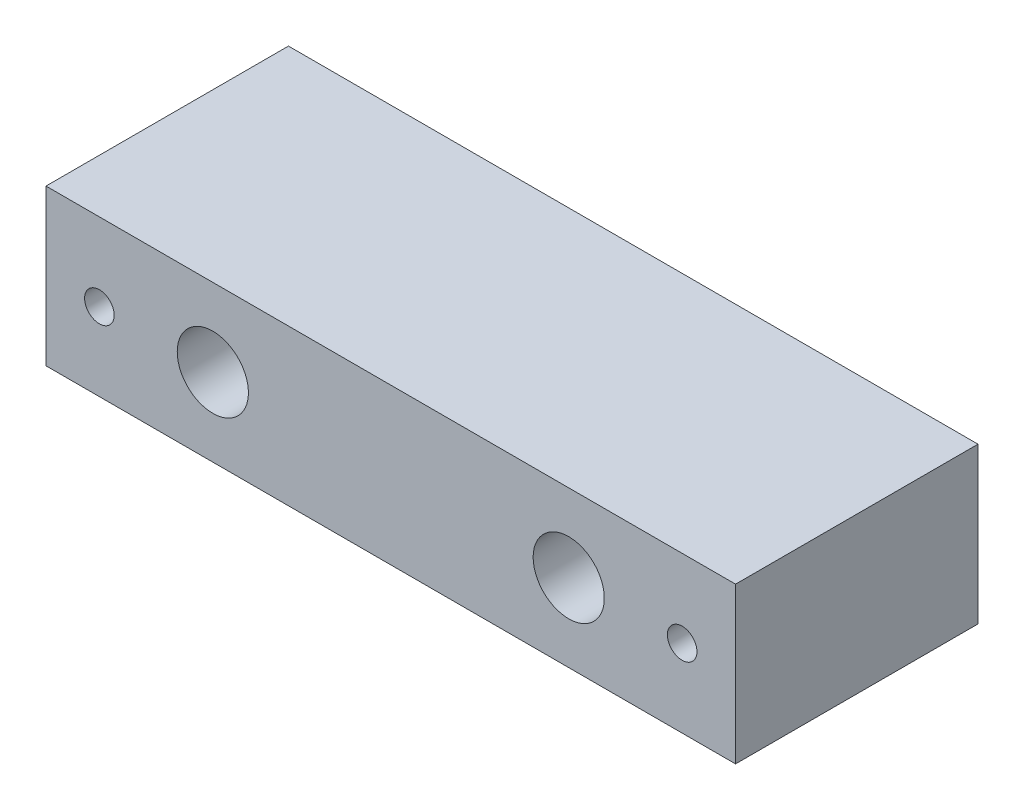
ISO-10303-21;
HEADER;
FILE_DESCRIPTION(('STEP AP214'),'2;1');
FILE_NAME('part.step','',(''),(''),'','','');
FILE_SCHEMA(('AUTOMOTIVE_DESIGN { 1 0 10303 214 1 1 1 1 }'));
ENDSEC;
DATA;
#1=APPLICATION_CONTEXT('core data for automotive mechanical design processes');
#2=APPLICATION_PROTOCOL_DEFINITION('international standard','automotive_design',2000,#1);
#3=PRODUCT_CONTEXT('',#1,'mechanical');
#4=PRODUCT('Part','Part','',(#3));
#5=PRODUCT_RELATED_PRODUCT_CATEGORY('part','',(#4));
#6=PRODUCT_DEFINITION_FORMATION('','',#4);
#7=PRODUCT_DEFINITION_CONTEXT('part definition',#1,'design');
#8=PRODUCT_DEFINITION('design','',#6,#7);
#9=PRODUCT_DEFINITION_SHAPE('','',#8);
#10=(LENGTH_UNIT() NAMED_UNIT(*) SI_UNIT(.MILLI.,.METRE.));
#11=(NAMED_UNIT(*) PLANE_ANGLE_UNIT() SI_UNIT($,.RADIAN.));
#12=(NAMED_UNIT(*) SI_UNIT($,.STERADIAN.) SOLID_ANGLE_UNIT());
#13=UNCERTAINTY_MEASURE_WITH_UNIT(LENGTH_MEASURE(1.E-05),#10,'distance_accuracy_value','');
#14=(GEOMETRIC_REPRESENTATION_CONTEXT(3) GLOBAL_UNCERTAINTY_ASSIGNED_CONTEXT((#13)) GLOBAL_UNIT_ASSIGNED_CONTEXT((#10,
#11,#12)) REPRESENTATION_CONTEXT('',''));
#15=CARTESIAN_POINT('',(0.,0.,0.));
#16=DIRECTION('',(0.,0.,1.));
#17=DIRECTION('',(1.,0.,0.));
#18=AXIS2_PLACEMENT_3D('',#15,#16,#17);
#19=CARTESIAN_POINT('',(0.,0.,54.5));
#20=DIRECTION('',(0.,0.,1.));
#21=DIRECTION('',(1.,0.,0.));
#22=AXIS2_PLACEMENT_3D('',#19,#20,#21);
#23=PLANE('',#22);
#24=CARTESIAN_POINT('',(65.5,0.,54.5));
#25=DIRECTION('',(0.,0.,-1.));
#26=DIRECTION('',(1.,0.,0.));
#27=AXIS2_PLACEMENT_3D('',#24,#25,#26);
#28=CIRCLE('',#27,3.3235);
#29=CARTESIAN_POINT('',(62.1765,0.,54.5));
#30=VERTEX_POINT('',#29);
#31=EDGE_CURVE('E211',#30,#30,#28,.T.);
#32=ORIENTED_EDGE('',*,*,#31,.T.);
#33=EDGE_LOOP('',(#32));
#34=FACE_BOUND('',#33,.T.);
#35=CARTESIAN_POINT('',(-65.5,0.,54.5));
#36=DIRECTION('',(0.,0.,-1.));
#37=DIRECTION('',(1.,0.,0.));
#38=AXIS2_PLACEMENT_3D('',#35,#36,#37);
#39=CIRCLE('',#38,3.3235);
#40=CARTESIAN_POINT('',(-68.8235,0.,54.5));
#41=VERTEX_POINT('',#40);
#42=EDGE_CURVE('E149',#41,#41,#39,.T.);
#43=ORIENTED_EDGE('',*,*,#42,.T.);
#44=EDGE_LOOP('',(#43));
#45=FACE_BOUND('',#44,.T.);
#46=CARTESIAN_POINT('',(40.,0.,54.5));
#47=DIRECTION('',(0.,0.,-1.));
#48=DIRECTION('',(1.,0.,0.));
#49=AXIS2_PLACEMENT_3D('',#46,#47,#48);
#50=CIRCLE('',#49,8.);
#51=CARTESIAN_POINT('',(32.,0.,54.5));
#52=VERTEX_POINT('',#51);
#53=EDGE_CURVE('E184',#52,#52,#50,.T.);
#54=ORIENTED_EDGE('',*,*,#53,.T.);
#55=EDGE_LOOP('',(#54));
#56=FACE_BOUND('',#55,.T.);
#57=CARTESIAN_POINT('',(-40.,0.,54.5));
#58=DIRECTION('',(0.,0.,-1.));
#59=DIRECTION('',(1.,0.,0.));
#60=AXIS2_PLACEMENT_3D('',#57,#58,#59);
#61=CIRCLE('',#60,8.);
#62=CARTESIAN_POINT('',(-48.,0.,54.5));
#63=VERTEX_POINT('',#62);
#64=EDGE_CURVE('E203',#63,#63,#61,.T.);
#65=ORIENTED_EDGE('',*,*,#64,.T.);
#66=EDGE_LOOP('',(#65));
#67=FACE_BOUND('',#66,.T.);
#68=DIRECTION('',(-1.,0.,0.));
#69=VECTOR('',#68,1.);
#70=CARTESIAN_POINT('',(-77.5,17.5,54.5));
#71=LINE('',#70,#69);
#72=CARTESIAN_POINT('',(77.5,17.5,54.5));
#73=VERTEX_POINT('',#72);
#74=CARTESIAN_POINT('',(-77.5,17.5,54.5));
#75=VERTEX_POINT('',#74);
#76=EDGE_CURVE('E11',#73,#75,#71,.T.);
#77=ORIENTED_EDGE('',*,*,#76,.T.);
#78=DIRECTION('',(0.,-1.,0.));
#79=VECTOR('',#78,1.);
#80=CARTESIAN_POINT('',(-77.5,-17.5,54.5));
#81=LINE('',#80,#79);
#82=CARTESIAN_POINT('',(-77.5,-17.5,54.5));
#83=VERTEX_POINT('',#82);
#84=EDGE_CURVE('E113',#75,#83,#81,.T.);
#85=ORIENTED_EDGE('',*,*,#84,.T.);
#86=DIRECTION('',(1.,0.,0.));
#87=VECTOR('',#86,1.);
#88=CARTESIAN_POINT('',(77.5,-17.5,54.5));
#89=LINE('',#88,#87);
#90=CARTESIAN_POINT('',(77.5,-17.5,54.5));
#91=VERTEX_POINT('',#90);
#92=EDGE_CURVE('E116',#83,#91,#89,.T.);
#93=ORIENTED_EDGE('',*,*,#92,.T.);
#94=DIRECTION('',(0.,1.,0.));
#95=VECTOR('',#94,1.);
#96=CARTESIAN_POINT('',(77.5,17.5,54.5));
#97=LINE('',#96,#95);
#98=EDGE_CURVE('E173',#91,#73,#97,.T.);
#99=ORIENTED_EDGE('',*,*,#98,.T.);
#100=EDGE_LOOP('',(#77,#85,#93,#99));
#101=FACE_BOUND('',#100,.T.);
#102=ADVANCED_FACE('F17',(#34,#45,#56,#67,#101),#23,.T.);
#103=CARTESIAN_POINT('',(0.,0.,0.));
#104=DIRECTION('',(0.,0.,1.));
#105=DIRECTION('',(1.,0.,0.));
#106=AXIS2_PLACEMENT_3D('',#103,#104,#105);
#107=PLANE('',#106);
#108=CARTESIAN_POINT('',(40.,0.,0.));
#109=DIRECTION('',(0.,0.,1.));
#110=DIRECTION('',(1.,0.,0.));
#111=AXIS2_PLACEMENT_3D('',#108,#109,#110);
#112=CIRCLE('',#111,4.05);
#113=CARTESIAN_POINT('',(35.95,0.,0.));
#114=VERTEX_POINT('',#113);
#115=EDGE_CURVE('E183',#114,#114,#112,.T.);
#116=ORIENTED_EDGE('',*,*,#115,.T.);
#117=EDGE_LOOP('',(#116));
#118=FACE_BOUND('',#117,.T.);
#119=CARTESIAN_POINT('',(-40.,0.,0.));
#120=DIRECTION('',(0.,0.,1.));
#121=DIRECTION('',(1.,0.,0.));
#122=AXIS2_PLACEMENT_3D('',#119,#120,#121);
#123=CIRCLE('',#122,4.05);
#124=CARTESIAN_POINT('',(-44.05,0.,0.));
#125=VERTEX_POINT('',#124);
#126=EDGE_CURVE('E207',#125,#125,#123,.T.);
#127=ORIENTED_EDGE('',*,*,#126,.T.);
#128=EDGE_LOOP('',(#127));
#129=FACE_BOUND('',#128,.T.);
#130=DIRECTION('',(1.,0.,0.));
#131=VECTOR('',#130,1.);
#132=CARTESIAN_POINT('',(-77.5,17.5,0.));
#133=LINE('',#132,#131);
#134=CARTESIAN_POINT('',(-77.5,17.5,0.));
#135=VERTEX_POINT('',#134);
#136=CARTESIAN_POINT('',(77.5,17.5,0.));
#137=VERTEX_POINT('',#136);
#138=EDGE_CURVE('E28',#135,#137,#133,.T.);
#139=ORIENTED_EDGE('',*,*,#138,.T.);
#140=DIRECTION('',(0.,-1.,0.));
#141=VECTOR('',#140,1.);
#142=CARTESIAN_POINT('',(77.5,17.5,0.));
#143=LINE('',#142,#141);
#144=CARTESIAN_POINT('',(77.5,-17.5,0.));
#145=VERTEX_POINT('',#144);
#146=EDGE_CURVE('E176',#137,#145,#143,.T.);
#147=ORIENTED_EDGE('',*,*,#146,.T.);
#148=DIRECTION('',(-1.,0.,0.));
#149=VECTOR('',#148,1.);
#150=CARTESIAN_POINT('',(77.5,-17.5,0.));
#151=LINE('',#150,#149);
#152=CARTESIAN_POINT('',(-77.5,-17.5,0.));
#153=VERTEX_POINT('',#152);
#154=EDGE_CURVE('E136',#145,#153,#151,.T.);
#155=ORIENTED_EDGE('',*,*,#154,.T.);
#156=DIRECTION('',(0.,1.,0.));
#157=VECTOR('',#156,1.);
#158=CARTESIAN_POINT('',(-77.5,-17.5,0.));
#159=LINE('',#158,#157);
#160=EDGE_CURVE('E122',#153,#135,#159,.T.);
#161=ORIENTED_EDGE('',*,*,#160,.T.);
#162=EDGE_LOOP('',(#139,#147,#155,#161));
#163=FACE_BOUND('',#162,.T.);
#164=ADVANCED_FACE('F252',(#118,#129,#163),#107,.F.);
#165=CARTESIAN_POINT('',(77.5,17.5,0.));
#166=DIRECTION('',(0.,1.,0.));
#167=DIRECTION('',(1.,0.,0.));
#168=AXIS2_PLACEMENT_3D('',#165,#166,#167);
#169=PLANE('',#168);
#170=ORIENTED_EDGE('',*,*,#138,.F.);
#171=DIRECTION('',(0.,0.,1.));
#172=VECTOR('',#171,1.);
#173=CARTESIAN_POINT('',(-77.5,17.5,0.));
#174=LINE('',#173,#172);
#175=EDGE_CURVE('E121',#135,#75,#174,.T.);
#176=ORIENTED_EDGE('',*,*,#175,.T.);
#177=ORIENTED_EDGE('',*,*,#76,.F.);
#178=DIRECTION('',(0.,0.,1.));
#179=VECTOR('',#178,1.);
#180=CARTESIAN_POINT('',(77.5,17.5,0.));
#181=LINE('',#180,#179);
#182=EDGE_CURVE('E21',#137,#73,#181,.T.);
#183=ORIENTED_EDGE('',*,*,#182,.F.);
#184=EDGE_LOOP('',(#170,#176,#177,#183));
#185=FACE_BOUND('',#184,.T.);
#186=ADVANCED_FACE('F320',(#185),#169,.T.);
#187=CARTESIAN_POINT('',(-77.5,17.5,0.));
#188=DIRECTION('',(-1.,0.,0.));
#189=DIRECTION('',(0.,0.,1.));
#190=AXIS2_PLACEMENT_3D('',#187,#188,#189);
#191=PLANE('',#190);
#192=ORIENTED_EDGE('',*,*,#160,.F.);
#193=DIRECTION('',(0.,0.,1.));
#194=VECTOR('',#193,1.);
#195=CARTESIAN_POINT('',(-77.5,-17.5,0.));
#196=LINE('',#195,#194);
#197=EDGE_CURVE('E125',#153,#83,#196,.T.);
#198=ORIENTED_EDGE('',*,*,#197,.T.);
#199=ORIENTED_EDGE('',*,*,#84,.F.);
#200=ORIENTED_EDGE('',*,*,#175,.F.);
#201=EDGE_LOOP('',(#192,#198,#199,#200));
#202=FACE_BOUND('',#201,.T.);
#203=ADVANCED_FACE('F126',(#202),#191,.T.);
#204=CARTESIAN_POINT('',(-77.5,-17.5,0.));
#205=DIRECTION('',(0.,-1.,0.));
#206=DIRECTION('',(0.,0.,-1.));
#207=AXIS2_PLACEMENT_3D('',#204,#205,#206);
#208=PLANE('',#207);
#209=ORIENTED_EDGE('',*,*,#154,.F.);
#210=DIRECTION('',(0.,0.,1.));
#211=VECTOR('',#210,1.);
#212=CARTESIAN_POINT('',(77.5,-17.5,0.));
#213=LINE('',#212,#211);
#214=EDGE_CURVE('E133',#145,#91,#213,.T.);
#215=ORIENTED_EDGE('',*,*,#214,.T.);
#216=ORIENTED_EDGE('',*,*,#92,.F.);
#217=ORIENTED_EDGE('',*,*,#197,.F.);
#218=EDGE_LOOP('',(#209,#215,#216,#217));
#219=FACE_BOUND('',#218,.T.);
#220=ADVANCED_FACE('F19',(#219),#208,.T.);
#221=CARTESIAN_POINT('',(77.5,-17.5,0.));
#222=DIRECTION('',(1.,0.,0.));
#223=DIRECTION('',(0.,1.,0.));
#224=AXIS2_PLACEMENT_3D('',#221,#222,#223);
#225=PLANE('',#224);
#226=ORIENTED_EDGE('',*,*,#146,.F.);
#227=ORIENTED_EDGE('',*,*,#182,.T.);
#228=ORIENTED_EDGE('',*,*,#98,.F.);
#229=ORIENTED_EDGE('',*,*,#214,.F.);
#230=EDGE_LOOP('',(#226,#227,#228,#229));
#231=FACE_BOUND('',#230,.T.);
#232=ADVANCED_FACE('F280',(#231),#225,.T.);
#233=CARTESIAN_POINT('',(65.5,0.,44.5));
#234=DIRECTION('',(0.,0.,1.));
#235=DIRECTION('',(1.,0.,0.));
#236=AXIS2_PLACEMENT_3D('',#233,#234,#235);
#237=CYLINDRICAL_SURFACE('',#236,3.3235);
#238=ORIENTED_EDGE('',*,*,#31,.F.);
#239=DIRECTION('',(0.,0.,-1.));
#240=VECTOR('',#239,1.);
#241=CARTESIAN_POINT('',(62.1765,0.,44.5));
#242=LINE('',#241,#240);
#243=CARTESIAN_POINT('',(62.1765,0.,34.5));
#244=VERTEX_POINT('',#243);
#245=EDGE_CURVE('E180',#30,#244,#242,.T.);
#246=ORIENTED_EDGE('',*,*,#245,.T.);
#247=CARTESIAN_POINT('',(65.5,0.,34.5));
#248=DIRECTION('',(0.,0.,1.));
#249=DIRECTION('',(1.,0.,0.));
#250=AXIS2_PLACEMENT_3D('',#247,#248,#249);
#251=CIRCLE('',#250,3.3235);
#252=EDGE_CURVE('E148',#244,#244,#251,.T.);
#253=ORIENTED_EDGE('',*,*,#252,.F.);
#254=ORIENTED_EDGE('',*,*,#245,.F.);
#255=EDGE_LOOP('',(#238,#246,#253,#254));
#256=FACE_BOUND('',#255,.T.);
#257=ADVANCED_FACE('F277',(#256),#237,.F.);
#258=CARTESIAN_POINT('',(65.5,0.,33.501519866331));
#259=DIRECTION('',(0.,0.,1.));
#260=DIRECTION('',(1.,0.,0.));
#261=AXIS2_PLACEMENT_3D('',#258,#259,#260);
#262=CONICAL_SURFACE('',#261,1.66175,1.02974425867665);
#263=ORIENTED_EDGE('',*,*,#252,.T.);
#264=DIRECTION('',(0.857167300702112,0.,-0.515038074910054));
#265=VECTOR('',#264,1.);
#266=CARTESIAN_POINT('',(63.83825,0.,33.501519866331));
#267=LINE('',#266,#265);
#268=CARTESIAN_POINT('',(65.5,0.,32.5030397326619));
#269=VERTEX_POINT('',#268);
#270=EDGE_CURVE('E160',#244,#269,#267,.T.);
#271=ORIENTED_EDGE('',*,*,#270,.T.);
#272=ORIENTED_EDGE('',*,*,#270,.F.);
#273=EDGE_LOOP('',(#263,#271,#272));
#274=FACE_BOUND('',#273,.T.);
#275=ADVANCED_FACE('F274',(#274),#262,.F.);
#276=CARTESIAN_POINT('',(-65.5,0.,44.5));
#277=DIRECTION('',(0.,0.,1.));
#278=DIRECTION('',(1.,0.,0.));
#279=AXIS2_PLACEMENT_3D('',#276,#277,#278);
#280=CYLINDRICAL_SURFACE('',#279,3.3235);
#281=ORIENTED_EDGE('',*,*,#42,.F.);
#282=DIRECTION('',(0.,0.,-1.));
#283=VECTOR('',#282,1.);
#284=CARTESIAN_POINT('',(-68.8235,0.,44.5));
#285=LINE('',#284,#283);
#286=CARTESIAN_POINT('',(-68.8235,0.,34.5));
#287=VERTEX_POINT('',#286);
#288=EDGE_CURVE('E146',#41,#287,#285,.T.);
#289=ORIENTED_EDGE('',*,*,#288,.T.);
#290=CARTESIAN_POINT('',(-65.5,0.,34.5));
#291=DIRECTION('',(0.,0.,1.));
#292=DIRECTION('',(1.,0.,0.));
#293=AXIS2_PLACEMENT_3D('',#290,#291,#292);
#294=CIRCLE('',#293,3.3235);
#295=EDGE_CURVE('E170',#287,#287,#294,.T.);
#296=ORIENTED_EDGE('',*,*,#295,.F.);
#297=ORIENTED_EDGE('',*,*,#288,.F.);
#298=EDGE_LOOP('',(#281,#289,#296,#297));
#299=FACE_BOUND('',#298,.T.);
#300=ADVANCED_FACE('F276',(#299),#280,.F.);
#301=CARTESIAN_POINT('',(-65.5,0.,33.501519866331));
#302=DIRECTION('',(0.,0.,1.));
#303=DIRECTION('',(1.,0.,0.));
#304=AXIS2_PLACEMENT_3D('',#301,#302,#303);
#305=CONICAL_SURFACE('',#304,1.66175,1.02974425867665);
#306=ORIENTED_EDGE('',*,*,#295,.T.);
#307=DIRECTION('',(0.857167300702112,0.,-0.515038074910054));
#308=VECTOR('',#307,1.);
#309=CARTESIAN_POINT('',(-67.16175,0.,33.501519866331));
#310=LINE('',#309,#308);
#311=CARTESIAN_POINT('',(-65.5,0.,32.5030397326619));
#312=VERTEX_POINT('',#311);
#313=EDGE_CURVE('E163',#287,#312,#310,.T.);
#314=ORIENTED_EDGE('',*,*,#313,.T.);
#315=ORIENTED_EDGE('',*,*,#313,.F.);
#316=EDGE_LOOP('',(#306,#314,#315));
#317=FACE_BOUND('',#316,.T.);
#318=ADVANCED_FACE('F307',(#317),#305,.F.);
#319=CARTESIAN_POINT('',(40.,0.,-113.488838914971));
#320=DIRECTION('',(0.,0.,1.));
#321=DIRECTION('',(1.,0.,0.));
#322=AXIS2_PLACEMENT_3D('',#319,#320,#321);
#323=CYLINDRICAL_SURFACE('',#322,4.05);
#324=CARTESIAN_POINT('',(40.,0.,10.));
#325=DIRECTION('',(0.,0.,1.));
#326=DIRECTION('',(1.,0.,0.));
#327=AXIS2_PLACEMENT_3D('',#324,#325,#326);
#328=CIRCLE('',#327,4.05);
#329=CARTESIAN_POINT('',(35.95,0.,10.));
#330=VERTEX_POINT('',#329);
#331=EDGE_CURVE('E188',#330,#330,#328,.T.);
#332=ORIENTED_EDGE('',*,*,#331,.T.);
#333=DIRECTION('',(0.,0.,-1.));
#334=VECTOR('',#333,1.);
#335=CARTESIAN_POINT('',(35.95,0.,-113.488838914971));
#336=LINE('',#335,#334);
#337=EDGE_CURVE('E83',#330,#114,#336,.T.);
#338=ORIENTED_EDGE('',*,*,#337,.T.);
#339=ORIENTED_EDGE('',*,*,#115,.F.);
#340=ORIENTED_EDGE('',*,*,#337,.F.);
#341=EDGE_LOOP('',(#332,#338,#339,#340));
#342=FACE_BOUND('',#341,.T.);
#343=ADVANCED_FACE('F241',(#342),#323,.F.);
#344=CARTESIAN_POINT('',(40.,0.,32.25));
#345=DIRECTION('',(0.,0.,1.));
#346=DIRECTION('',(1.,0.,0.));
#347=AXIS2_PLACEMENT_3D('',#344,#345,#346);
#348=CYLINDRICAL_SURFACE('',#347,8.);
#349=ORIENTED_EDGE('',*,*,#53,.F.);
#350=DIRECTION('',(0.,0.,-1.));
#351=VECTOR('',#350,1.);
#352=CARTESIAN_POINT('',(32.,0.,32.25));
#353=LINE('',#352,#351);
#354=CARTESIAN_POINT('',(32.,0.,10.));
#355=VERTEX_POINT('',#354);
#356=EDGE_CURVE('E96',#52,#355,#353,.T.);
#357=ORIENTED_EDGE('',*,*,#356,.T.);
#358=CARTESIAN_POINT('',(40.,0.,10.));
#359=DIRECTION('',(0.,0.,1.));
#360=DIRECTION('',(1.,0.,0.));
#361=AXIS2_PLACEMENT_3D('',#358,#359,#360);
#362=CIRCLE('',#361,8.);
#363=EDGE_CURVE('E204',#355,#355,#362,.T.);
#364=ORIENTED_EDGE('',*,*,#363,.F.);
#365=ORIENTED_EDGE('',*,*,#356,.F.);
#366=EDGE_LOOP('',(#349,#357,#364,#365));
#367=FACE_BOUND('',#366,.T.);
#368=ADVANCED_FACE('F247',(#367),#348,.F.);
#369=CARTESIAN_POINT('',(40.,0.,10.));
#370=DIRECTION('',(0.,0.,1.));
#371=DIRECTION('',(1.,0.,0.));
#372=AXIS2_PLACEMENT_3D('',#369,#370,#371);
#373=PLANE('',#372);
#374=ORIENTED_EDGE('',*,*,#331,.F.);
#375=EDGE_LOOP('',(#374));
#376=FACE_BOUND('',#375,.T.);
#377=ORIENTED_EDGE('',*,*,#363,.T.);
#378=EDGE_LOOP('',(#377));
#379=FACE_BOUND('',#378,.T.);
#380=ADVANCED_FACE('F243',(#376,#379),#373,.T.);
#381=CARTESIAN_POINT('',(-40.,0.,-113.488838914971));
#382=DIRECTION('',(0.,0.,1.));
#383=DIRECTION('',(1.,0.,0.));
#384=AXIS2_PLACEMENT_3D('',#381,#382,#383);
#385=CYLINDRICAL_SURFACE('',#384,4.05);
#386=CARTESIAN_POINT('',(-40.,0.,10.));
#387=DIRECTION('',(0.,0.,1.));
#388=DIRECTION('',(1.,0.,0.));
#389=AXIS2_PLACEMENT_3D('',#386,#387,#388);
#390=CIRCLE('',#389,4.05);
#391=CARTESIAN_POINT('',(-44.05,0.,10.));
#392=VERTEX_POINT('',#391);
#393=EDGE_CURVE('E192',#392,#392,#390,.T.);
#394=ORIENTED_EDGE('',*,*,#393,.T.);
#395=DIRECTION('',(0.,0.,-1.));
#396=VECTOR('',#395,1.);
#397=CARTESIAN_POINT('',(-44.05,0.,-113.488838914971));
#398=LINE('',#397,#396);
#399=EDGE_CURVE('E144',#392,#125,#398,.T.);
#400=ORIENTED_EDGE('',*,*,#399,.T.);
#401=ORIENTED_EDGE('',*,*,#126,.F.);
#402=ORIENTED_EDGE('',*,*,#399,.F.);
#403=EDGE_LOOP('',(#394,#400,#401,#402));
#404=FACE_BOUND('',#403,.T.);
#405=ADVANCED_FACE('F246',(#404),#385,.F.);
#406=CARTESIAN_POINT('',(-40.,0.,32.25));
#407=DIRECTION('',(0.,0.,1.));
#408=DIRECTION('',(1.,0.,0.));
#409=AXIS2_PLACEMENT_3D('',#406,#407,#408);
#410=CYLINDRICAL_SURFACE('',#409,8.);
#411=ORIENTED_EDGE('',*,*,#64,.F.);
#412=DIRECTION('',(0.,0.,-1.));
#413=VECTOR('',#412,1.);
#414=CARTESIAN_POINT('',(-48.,0.,32.25));
#415=LINE('',#414,#413);
#416=CARTESIAN_POINT('',(-48.,0.,10.));
#417=VERTEX_POINT('',#416);
#418=EDGE_CURVE('E216',#63,#417,#415,.T.);
#419=ORIENTED_EDGE('',*,*,#418,.T.);
#420=CARTESIAN_POINT('',(-40.,0.,10.));
#421=DIRECTION('',(0.,0.,1.));
#422=DIRECTION('',(1.,0.,0.));
#423=AXIS2_PLACEMENT_3D('',#420,#421,#422);
#424=CIRCLE('',#423,8.);
#425=EDGE_CURVE('E189',#417,#417,#424,.T.);
#426=ORIENTED_EDGE('',*,*,#425,.F.);
#427=ORIENTED_EDGE('',*,*,#418,.F.);
#428=EDGE_LOOP('',(#411,#419,#426,#427));
#429=FACE_BOUND('',#428,.T.);
#430=ADVANCED_FACE('F257',(#429),#410,.F.);
#431=CARTESIAN_POINT('',(-40.,0.,10.));
#432=DIRECTION('',(0.,0.,1.));
#433=DIRECTION('',(1.,0.,0.));
#434=AXIS2_PLACEMENT_3D('',#431,#432,#433);
#435=PLANE('',#434);
#436=ORIENTED_EDGE('',*,*,#393,.F.);
#437=EDGE_LOOP('',(#436));
#438=FACE_BOUND('',#437,.T.);
#439=ORIENTED_EDGE('',*,*,#425,.T.);
#440=EDGE_LOOP('',(#439));
#441=FACE_BOUND('',#440,.T.);
#442=ADVANCED_FACE('F260',(#438,#441),#435,.T.);
#443=CLOSED_SHELL('',(#102,#164,#186,#203,#220,#232,#257,#275,#300,#318,#343,#368,#380,#405,
#430,#442));
#444=MANIFOLD_SOLID_BREP('B1',#443);
#445=ADVANCED_BREP_SHAPE_REPRESENTATION('',(#18,#444),#14);
#446=SHAPE_DEFINITION_REPRESENTATION(#9,#445);
ENDSEC;
END-ISO-10303-21;
